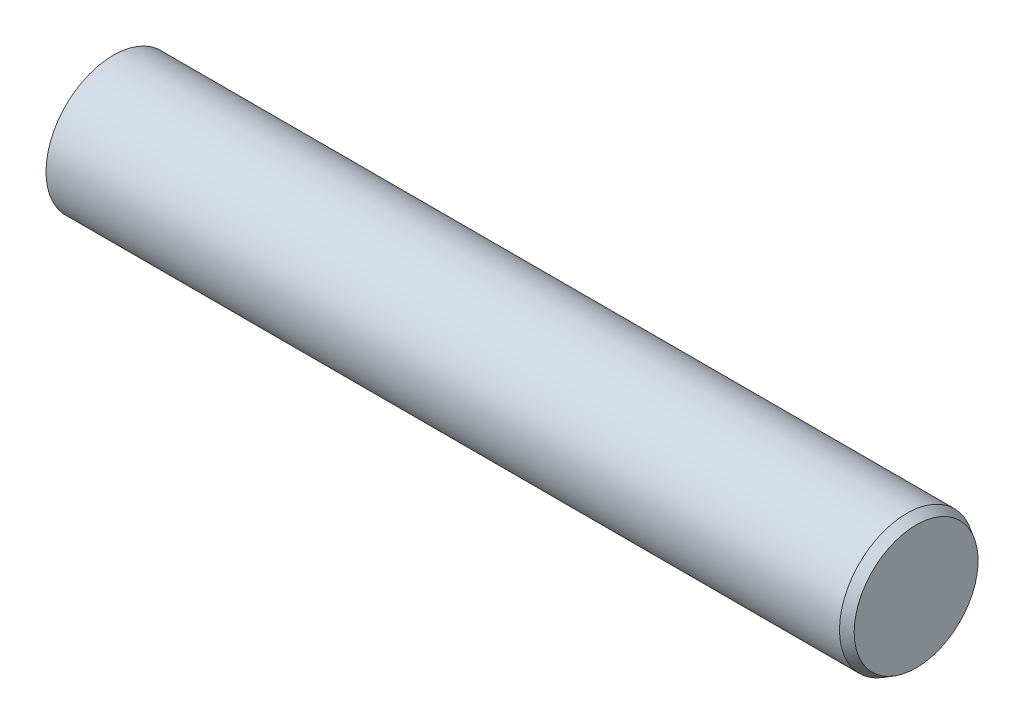
ISO-10303-21;
HEADER;
FILE_DESCRIPTION(('STEP AP214'),'2;1');
FILE_NAME('part.step','',(''),(''),'','','');
FILE_SCHEMA(('AUTOMOTIVE_DESIGN { 1 0 10303 214 1 1 1 1 }'));
ENDSEC;
DATA;
#1=APPLICATION_CONTEXT('core data for automotive mechanical design processes');
#2=APPLICATION_PROTOCOL_DEFINITION('international standard','automotive_design',2000,#1);
#3=PRODUCT_CONTEXT('',#1,'mechanical');
#4=PRODUCT('Part','Part','',(#3));
#5=PRODUCT_RELATED_PRODUCT_CATEGORY('part','',(#4));
#6=PRODUCT_DEFINITION_FORMATION('','',#4);
#7=PRODUCT_DEFINITION_CONTEXT('part definition',#1,'design');
#8=PRODUCT_DEFINITION('design','',#6,#7);
#9=PRODUCT_DEFINITION_SHAPE('','',#8);
#10=(LENGTH_UNIT() NAMED_UNIT(*) SI_UNIT(.MILLI.,.METRE.));
#11=(NAMED_UNIT(*) PLANE_ANGLE_UNIT() SI_UNIT($,.RADIAN.));
#12=(NAMED_UNIT(*) SI_UNIT($,.STERADIAN.) SOLID_ANGLE_UNIT());
#13=UNCERTAINTY_MEASURE_WITH_UNIT(LENGTH_MEASURE(1.E-05),#10,'distance_accuracy_value','');
#14=(GEOMETRIC_REPRESENTATION_CONTEXT(3) GLOBAL_UNCERTAINTY_ASSIGNED_CONTEXT((#13)) GLOBAL_UNIT_ASSIGNED_CONTEXT((#10,
#11,#12)) REPRESENTATION_CONTEXT('',''));
#15=CARTESIAN_POINT('',(0.,0.,0.));
#16=DIRECTION('',(0.,0.,1.));
#17=DIRECTION('',(1.,0.,0.));
#18=AXIS2_PLACEMENT_3D('',#15,#16,#17);
#19=CARTESIAN_POINT('',(0.,0.,0.));
#20=DIRECTION('',(1.,0.,0.));
#21=DIRECTION('',(0.,0.,-1.));
#22=AXIS2_PLACEMENT_3D('',#19,#20,#21);
#23=PLANE('',#22);
#24=CARTESIAN_POINT('',(0.,0.,0.));
#25=DIRECTION('',(1.,0.,0.));
#26=DIRECTION('',(0.,0.,-1.));
#27=AXIS2_PLACEMENT_3D('',#24,#25,#26);
#28=CIRCLE('',#27,2.15358983848622);
#29=CARTESIAN_POINT('',(0.,0.,-2.15358983848622));
#30=VERTEX_POINT('',#29);
#31=EDGE_CURVE('E10',#30,#30,#28,.F.);
#32=ORIENTED_EDGE('',*,*,#31,.T.);
#33=EDGE_LOOP('',(#32));
#34=FACE_BOUND('',#33,.T.);
#35=ADVANCED_FACE('F32',(#34),#23,.F.);
#36=CARTESIAN_POINT('',(0.,0.,0.));
#37=DIRECTION('',(-1.,0.,0.));
#38=DIRECTION('',(0.,0.,1.));
#39=AXIS2_PLACEMENT_3D('',#36,#37,#38);
#40=CYLINDRICAL_SURFACE('',#39,2.5);
#41=CARTESIAN_POINT('',(29.6535898384862,0.,0.));
#42=DIRECTION('',(-1.,0.,0.));
#43=DIRECTION('',(0.,0.,1.));
#44=AXIS2_PLACEMENT_3D('',#41,#42,#43);
#45=CIRCLE('',#44,2.5);
#46=CARTESIAN_POINT('',(29.6535898384862,0.,2.5));
#47=VERTEX_POINT('',#46);
#48=EDGE_CURVE('E44',#47,#47,#45,.T.);
#49=CARTESIAN_POINT('',(0.200000000000005,0.,0.));
#50=DIRECTION('',(1.,0.,0.));
#51=DIRECTION('',(0.,0.,-1.));
#52=AXIS2_PLACEMENT_3D('',#49,#50,#51);
#53=CIRCLE('',#52,2.5);
#54=CARTESIAN_POINT('',(0.200000000000005,0.,2.5));
#55=VERTEX_POINT('',#54);
#56=EDGE_CURVE('E48',#55,#55,#53,.T.);
#57=CARTESIAN_POINT('',(29.6535898384862,0.,2.5));
#58=CARTESIAN_POINT('',(29.346781611002,0.,2.5));
#59=CARTESIAN_POINT('',(29.0399733835178,0.,2.5));
#60=CARTESIAN_POINT('',(28.4263569285493,0.,2.5));
#61=CARTESIAN_POINT('',(28.1195487010651,0.,2.5));
#62=CARTESIAN_POINT('',(27.5059322460966,0.,2.5));
#63=CARTESIAN_POINT('',(27.1991240186124,0.,2.5));
#64=CARTESIAN_POINT('',(26.5855075636439,0.,2.5));
#65=CARTESIAN_POINT('',(26.2786993361597,0.,2.5));
#66=CARTESIAN_POINT('',(25.6650828811912,0.,2.5));
#67=CARTESIAN_POINT('',(25.358274653707,0.,2.5));
#68=CARTESIAN_POINT('',(24.7446581987385,0.,2.5));
#69=CARTESIAN_POINT('',(24.4378499712543,0.,2.5));
#70=CARTESIAN_POINT('',(23.8242335162858,0.,2.5));
#71=CARTESIAN_POINT('',(23.5174252888016,0.,2.5));
#72=CARTESIAN_POINT('',(22.9038088338331,0.,2.5));
#73=CARTESIAN_POINT('',(22.5970006063489,0.,2.5));
#74=CARTESIAN_POINT('',(21.9833841513804,0.,2.5));
#75=CARTESIAN_POINT('',(21.6765759238962,0.,2.5));
#76=CARTESIAN_POINT('',(21.0629594689278,0.,2.5));
#77=CARTESIAN_POINT('',(20.7561512414435,0.,2.5));
#78=CARTESIAN_POINT('',(20.1425347864751,0.,2.5));
#79=CARTESIAN_POINT('',(19.8357265589908,0.,2.5));
#80=CARTESIAN_POINT('',(19.2221101040224,0.,2.5));
#81=CARTESIAN_POINT('',(18.9153018765381,0.,2.5));
#82=CARTESIAN_POINT('',(18.3016854215697,0.,2.5));
#83=CARTESIAN_POINT('',(17.9948771940854,0.,2.5));
#84=CARTESIAN_POINT('',(17.381260739117,0.,2.5));
#85=CARTESIAN_POINT('',(17.0744525116327,0.,2.5));
#86=CARTESIAN_POINT('',(16.4608360566643,0.,2.5));
#87=CARTESIAN_POINT('',(16.15402782918,0.,2.5));
#88=CARTESIAN_POINT('',(15.5404113742116,0.,2.5));
#89=CARTESIAN_POINT('',(15.2336031467274,0.,2.5));
#90=CARTESIAN_POINT('',(14.6199866917589,0.,2.5));
#91=CARTESIAN_POINT('',(14.3131784642747,0.,2.5));
#92=CARTESIAN_POINT('',(13.6995620093062,0.,2.5));
#93=CARTESIAN_POINT('',(13.392753781822,0.,2.5));
#94=CARTESIAN_POINT('',(12.7791373268535,0.,2.5));
#95=CARTESIAN_POINT('',(12.4723290993693,0.,2.5));
#96=CARTESIAN_POINT('',(11.8587126444008,0.,2.5));
#97=CARTESIAN_POINT('',(11.5519044169166,0.,2.5));
#98=CARTESIAN_POINT('',(10.9382879619481,0.,2.5));
#99=CARTESIAN_POINT('',(10.6314797344639,0.,2.5));
#100=CARTESIAN_POINT('',(10.0178632794954,0.,2.5));
#101=CARTESIAN_POINT('',(9.71105505201118,0.,2.5));
#102=CARTESIAN_POINT('',(9.09743859704272,0.,2.5));
#103=CARTESIAN_POINT('',(8.79063036955849,0.,2.5));
#104=CARTESIAN_POINT('',(8.17701391459003,0.,2.5));
#105=CARTESIAN_POINT('',(7.87020568710579,0.,2.5));
#106=CARTESIAN_POINT('',(7.25658923213733,0.,2.5));
#107=CARTESIAN_POINT('',(6.9497810046531,0.,2.5));
#108=CARTESIAN_POINT('',(6.33616454968464,0.,2.5));
#109=CARTESIAN_POINT('',(6.0293563222004,0.,2.5));
#110=CARTESIAN_POINT('',(5.41573986723194,0.,2.5));
#111=CARTESIAN_POINT('',(5.10893163974771,0.,2.5));
#112=CARTESIAN_POINT('',(4.49531518477925,0.,2.5));
#113=CARTESIAN_POINT('',(4.18850695729502,0.,2.5));
#114=CARTESIAN_POINT('',(3.57489050232655,0.,2.5));
#115=CARTESIAN_POINT('',(3.26808227484232,0.,2.5));
#116=CARTESIAN_POINT('',(2.65446581987386,0.,2.5));
#117=CARTESIAN_POINT('',(2.34765759238963,0.,2.5));
#118=CARTESIAN_POINT('',(1.73404113742116,0.,2.5));
#119=CARTESIAN_POINT('',(1.42723290993693,0.,2.5));
#120=CARTESIAN_POINT('',(0.813616454968469,0.,2.5));
#121=CARTESIAN_POINT('',(0.506808227484237,0.,2.5));
#122=CARTESIAN_POINT('',(0.200000000000006,0.,2.5));
#123=B_SPLINE_CURVE_WITH_KNOTS('',3,(#57,#58,#59,#60,#61,#62,#63,#64,#65,#66,#67,#68,#69,#70,
#71,#72,#73,#74,#75,#76,#77,#78,#79,#80,#81,#82,#83,#84,#85,#86,#87,#88,#89,#90,#91,#92,#93,#94,
#95,#96,#97,#98,#99,#100,#101,#102,#103,#104,#105,#106,#107,#108,#109,#110,#111,#112,#113,#114,
#115,#116,#117,#118,#119,#120,#121,#122),.UNSPECIFIED.,.F.,.F.,(4,2,2,2,2,2,2,2,2,2,2,2,2,2,2,2,
2,2,2,2,2,2,2,2,2,2,2,2,2,2,2,2,4),(0.,0.920424682452695,1.84084936490539,2.76127404735808,
3.68169872981078,4.60212341226347,5.52254809471617,6.44297277716886,7.36339745962156,
8.28382214207425,9.20424682452695,10.1246715069796,11.0450961894323,11.965520871885,
12.8859455543377,13.8063702367904,14.7267949192431,15.6472196016958,16.5676442841485,
17.4880689666012,18.4084936490539,19.3289183315066,20.2493430139593,21.169767696412,
22.0901923788647,23.0106170613174,23.9310417437701,24.8514664262228,25.7718911086754,
26.6923157911281,27.6127404735808,28.5331651560335,29.4535898384862),.UNSPECIFIED.);
#124=EDGE_CURVE('BSEAM54',#47,#55,#123,.T.);
#125=ORIENTED_EDGE('',*,*,#48,.T.);
#126=ORIENTED_EDGE('',*,*,#56,.T.);
#127=ORIENTED_EDGE('',*,*,#124,.T.);
#128=ORIENTED_EDGE('',*,*,#124,.F.);
#129=EDGE_LOOP('',(#125,#127,#126,#128));
#130=FACE_BOUND('',#129,.T.);
#131=ADVANCED_FACE('F54',(#130),#40,.T.);
#132=CARTESIAN_POINT('',(30.,0.,0.));
#133=DIRECTION('',(-1.,0.,0.));
#134=DIRECTION('',(0.,0.,1.));
#135=AXIS2_PLACEMENT_3D('',#132,#133,#134);
#136=PLANE('',#135);
#137=CARTESIAN_POINT('',(30.,0.,0.));
#138=DIRECTION('',(-1.,0.,0.));
#139=DIRECTION('',(0.,0.,1.));
#140=AXIS2_PLACEMENT_3D('',#137,#138,#139);
#141=CIRCLE('',#140,2.30000000000001);
#142=CARTESIAN_POINT('',(30.,0.,2.3));
#143=VERTEX_POINT('',#142);
#144=EDGE_CURVE('E40',#143,#143,#141,.F.);
#145=ORIENTED_EDGE('',*,*,#144,.T.);
#146=EDGE_LOOP('',(#145));
#147=FACE_BOUND('',#146,.T.);
#148=ADVANCED_FACE('F62',(#147),#136,.F.);
#149=CARTESIAN_POINT('',(29.6535898384862,0.,0.));
#150=DIRECTION('',(-1.,0.,0.));
#151=DIRECTION('',(0.,0.,1.));
#152=AXIS2_PLACEMENT_3D('',#149,#150,#151);
#153=CONICAL_SURFACE('',#152,2.5,0.523598775598295);
#154=CARTESIAN_POINT('',(30.,0.,2.3));
#155=CARTESIAN_POINT('',(29.9963915608176,0.,2.30208333333334));
#156=CARTESIAN_POINT('',(29.9927831216351,0.,2.30416666666667));
#157=CARTESIAN_POINT('',(29.9855662432703,0.,2.30833333333334));
#158=CARTESIAN_POINT('',(29.9819578040878,0.,2.31041666666667));
#159=CARTESIAN_POINT('',(29.974740925723,0.,2.31458333333334));
#160=CARTESIAN_POINT('',(29.9711324865405,0.,2.31666666666667));
#161=CARTESIAN_POINT('',(29.9639156081757,0.,2.32083333333334));
#162=CARTESIAN_POINT('',(29.9603071689932,0.,2.32291666666667));
#163=CARTESIAN_POINT('',(29.9530902906283,0.,2.32708333333334));
#164=CARTESIAN_POINT('',(29.9494818514459,0.,2.32916666666667));
#165=CARTESIAN_POINT('',(29.942264973081,0.,2.33333333333334));
#166=CARTESIAN_POINT('',(29.9386565338986,0.,2.33541666666667));
#167=CARTESIAN_POINT('',(29.9314396555337,0.,2.33958333333334));
#168=CARTESIAN_POINT('',(29.9278312163513,0.,2.34166666666667));
#169=CARTESIAN_POINT('',(29.9206143379864,0.,2.34583333333334));
#170=CARTESIAN_POINT('',(29.917005898804,0.,2.34791666666667));
#171=CARTESIAN_POINT('',(29.9097890204391,0.,2.35208333333334));
#172=CARTESIAN_POINT('',(29.9061805812567,0.,2.35416666666667));
#173=CARTESIAN_POINT('',(29.8989637028918,0.,2.35833333333334));
#174=CARTESIAN_POINT('',(29.8953552637094,0.,2.36041666666667));
#175=CARTESIAN_POINT('',(29.8881383853445,0.,2.36458333333334));
#176=CARTESIAN_POINT('',(29.8845299461621,0.,2.36666666666667));
#177=CARTESIAN_POINT('',(29.8773130677972,0.,2.37083333333334));
#178=CARTESIAN_POINT('',(29.8737046286148,0.,2.37291666666667));
#179=CARTESIAN_POINT('',(29.8664877502499,0.,2.37708333333333));
#180=CARTESIAN_POINT('',(29.8628793110675,0.,2.37916666666667));
#181=CARTESIAN_POINT('',(29.8556624327026,0.,2.38333333333334));
#182=CARTESIAN_POINT('',(29.8520539935202,0.,2.38541666666667));
#183=CARTESIAN_POINT('',(29.8448371151553,0.,2.38958333333334));
#184=CARTESIAN_POINT('',(29.8412286759729,0.,2.39166666666667));
#185=CARTESIAN_POINT('',(29.834011797608,0.,2.39583333333334));
#186=CARTESIAN_POINT('',(29.8304033584256,0.,2.39791666666667));
#187=CARTESIAN_POINT('',(29.8231864800607,0.,2.40208333333333));
#188=CARTESIAN_POINT('',(29.8195780408782,0.,2.40416666666667));
#189=CARTESIAN_POINT('',(29.8123611625134,0.,2.40833333333333));
#190=CARTESIAN_POINT('',(29.8087527233309,0.,2.41041666666667));
#191=CARTESIAN_POINT('',(29.8015358449661,0.,2.41458333333334));
#192=CARTESIAN_POINT('',(29.7979274057836,0.,2.41666666666667));
#193=CARTESIAN_POINT('',(29.7907105274188,0.,2.42083333333333));
#194=CARTESIAN_POINT('',(29.7871020882363,0.,2.42291666666667));
#195=CARTESIAN_POINT('',(29.7798852098715,0.,2.42708333333333));
#196=CARTESIAN_POINT('',(29.776276770689,0.,2.42916666666667));
#197=CARTESIAN_POINT('',(29.7690598923242,0.,2.43333333333333));
#198=CARTESIAN_POINT('',(29.7654514531417,0.,2.43541666666667));
#199=CARTESIAN_POINT('',(29.7582345747768,0.,2.43958333333333));
#200=CARTESIAN_POINT('',(29.7546261355944,0.,2.44166666666667));
#201=CARTESIAN_POINT('',(29.7474092572295,0.,2.44583333333333));
#202=CARTESIAN_POINT('',(29.7438008180471,0.,2.44791666666667));
#203=CARTESIAN_POINT('',(29.7365839396822,0.,2.45208333333333));
#204=CARTESIAN_POINT('',(29.7329755004998,0.,2.45416666666667));
#205=CARTESIAN_POINT('',(29.7257586221349,0.,2.45833333333333));
#206=CARTESIAN_POINT('',(29.7221501829525,0.,2.46041666666667));
#207=CARTESIAN_POINT('',(29.7149333045876,0.,2.46458333333333));
#208=CARTESIAN_POINT('',(29.7113248654052,0.,2.46666666666667));
#209=CARTESIAN_POINT('',(29.7041079870403,0.,2.47083333333333));
#210=CARTESIAN_POINT('',(29.7004995478579,0.,2.47291666666667));
#211=CARTESIAN_POINT('',(29.693282669493,0.,2.47708333333333));
#212=CARTESIAN_POINT('',(29.6896742303106,0.,2.47916666666667));
#213=CARTESIAN_POINT('',(29.6824573519457,0.,2.48333333333333));
#214=CARTESIAN_POINT('',(29.6788489127633,0.,2.48541666666667));
#215=CARTESIAN_POINT('',(29.6716320343984,0.,2.48958333333333));
#216=CARTESIAN_POINT('',(29.668023595216,0.,2.49166666666667));
#217=CARTESIAN_POINT('',(29.6608067168511,0.,2.49583333333333));
#218=CARTESIAN_POINT('',(29.6571982776687,0.,2.49791666666667));
#219=CARTESIAN_POINT('',(29.6535898384862,0.,2.5));
#220=B_SPLINE_CURVE_WITH_KNOTS('',3,(#154,#155,#156,#157,#158,#159,#160,#161,#162,#163,#164,
#165,#166,#167,#168,#169,#170,#171,#172,#173,#174,#175,#176,#177,#178,#179,#180,#181,#182,#183,
#184,#185,#186,#187,#188,#189,#190,#191,#192,#193,#194,#195,#196,#197,#198,#199,#200,#201,#202,
#203,#204,#205,#206,#207,#208,#209,#210,#211,#212,#213,#214,#215,#216,#217,#218,#219),
.UNSPECIFIED.,.F.,.F.,(4,2,2,2,2,2,2,2,2,2,2,2,2,2,2,2,2,2,2,2,2,2,2,2,2,2,2,2,2,2,2,2,4),(0.,
0.0125000000000011,0.0250000000000022,0.0375000000000004,0.0500000000000015,0.0624999999999998,
0.0750000000000009,0.087499999999999,0.1,0.112499999999998,0.125,0.137499999999998,
0.149999999999999,0.162499999999997,0.174999999999998,0.187499999999996,0.199999999999997,
0.212499999999999,0.224999999999997,0.237499999999998,0.249999999999996,0.262499999999997,
0.274999999999995,0.287499999999997,0.299999999999995,0.312499999999996,0.324999999999994,
0.337499999999995,0.349999999999994,0.362499999999995,0.374999999999993,0.387499999999994,
0.399999999999995),.UNSPECIFIED.);
#221=EDGE_CURVE('BSEAM58',#143,#47,#220,.T.);
#222=ORIENTED_EDGE('',*,*,#144,.F.);
#223=ORIENTED_EDGE('',*,*,#48,.F.);
#224=ORIENTED_EDGE('',*,*,#221,.T.);
#225=ORIENTED_EDGE('',*,*,#221,.F.);
#226=EDGE_LOOP('',(#222,#224,#223,#225));
#227=FACE_BOUND('',#226,.T.);
#228=ADVANCED_FACE('F58',(#227),#153,.T.);
#229=CARTESIAN_POINT('',(0.,0.,0.));
#230=DIRECTION('',(1.,0.,0.));
#231=DIRECTION('',(0.,0.,-1.));
#232=AXIS2_PLACEMENT_3D('',#229,#230,#231);
#233=CONICAL_SURFACE('',#232,2.15358983848622,1.04719755119659);
#234=ORIENTED_EDGE('',*,*,#56,.F.);
#235=EDGE_LOOP('',(#234));
#236=FACE_BOUND('',#235,.T.);
#237=ORIENTED_EDGE('',*,*,#31,.F.);
#238=EDGE_LOOP('',(#237));
#239=FACE_BOUND('',#238,.T.);
#240=ADVANCED_FACE('F35',(#236,#239),#233,.T.);
#241=CLOSED_SHELL('',(#35,#131,#148,#228,#240));
#242=MANIFOLD_SOLID_BREP('B2',#241);
#243=ADVANCED_BREP_SHAPE_REPRESENTATION('',(#18,#242),#14);
#244=SHAPE_DEFINITION_REPRESENTATION(#9,#243);
ENDSEC;
END-ISO-10303-21;
